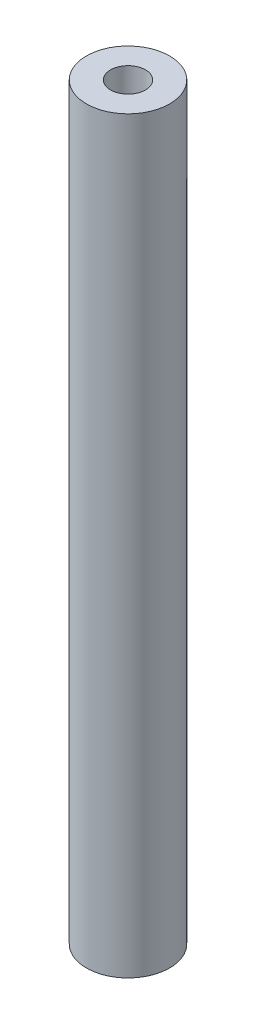
ISO-10303-21;
HEADER;
FILE_DESCRIPTION(('STEP AP214'),'2;1');
FILE_NAME('part.step','',(''),(''),'','','');
FILE_SCHEMA(('AUTOMOTIVE_DESIGN { 1 0 10303 214 1 1 1 1 }'));
ENDSEC;
DATA;
#1=APPLICATION_CONTEXT('core data for automotive mechanical design processes');
#2=APPLICATION_PROTOCOL_DEFINITION('international standard','automotive_design',2000,#1);
#3=PRODUCT_CONTEXT('',#1,'mechanical');
#4=PRODUCT('Part','Part','',(#3));
#5=PRODUCT_RELATED_PRODUCT_CATEGORY('part','',(#4));
#6=PRODUCT_DEFINITION_FORMATION('','',#4);
#7=PRODUCT_DEFINITION_CONTEXT('part definition',#1,'design');
#8=PRODUCT_DEFINITION('design','',#6,#7);
#9=PRODUCT_DEFINITION_SHAPE('','',#8);
#10=(LENGTH_UNIT() NAMED_UNIT(*) SI_UNIT(.MILLI.,.METRE.));
#11=(NAMED_UNIT(*) PLANE_ANGLE_UNIT() SI_UNIT($,.RADIAN.));
#12=(NAMED_UNIT(*) SI_UNIT($,.STERADIAN.) SOLID_ANGLE_UNIT());
#13=UNCERTAINTY_MEASURE_WITH_UNIT(LENGTH_MEASURE(1.E-05),#10,'distance_accuracy_value','');
#14=(GEOMETRIC_REPRESENTATION_CONTEXT(3) GLOBAL_UNCERTAINTY_ASSIGNED_CONTEXT((#13)) GLOBAL_UNIT_ASSIGNED_CONTEXT((#10,
#11,#12)) REPRESENTATION_CONTEXT('',''));
#15=CARTESIAN_POINT('',(0.,0.,0.));
#16=DIRECTION('',(0.,0.,1.));
#17=DIRECTION('',(1.,0.,0.));
#18=AXIS2_PLACEMENT_3D('',#15,#16,#17);
#19=CARTESIAN_POINT('',(0.,90.,0.));
#20=DIRECTION('',(0.,-1.,0.));
#21=DIRECTION('',(0.,0.,-1.));
#22=AXIS2_PLACEMENT_3D('',#19,#20,#21);
#23=CYLINDRICAL_SURFACE('',#22,5.);
#24=CARTESIAN_POINT('',(0.,90.,0.));
#25=DIRECTION('',(0.,1.,0.));
#26=DIRECTION('',(0.,0.,1.));
#27=AXIS2_PLACEMENT_3D('',#24,#25,#26);
#28=CIRCLE('',#27,5.);
#29=CARTESIAN_POINT('',(0.,90.,-5.));
#30=VERTEX_POINT('',#29);
#31=EDGE_CURVE('E10',#30,#30,#28,.T.);
#32=CARTESIAN_POINT('',(0.,0.,0.));
#33=DIRECTION('',(0.,1.,0.));
#34=DIRECTION('',(0.,0.,1.));
#35=AXIS2_PLACEMENT_3D('',#32,#33,#34);
#36=CIRCLE('',#35,5.);
#37=CARTESIAN_POINT('',(0.,0.,-5.));
#38=VERTEX_POINT('',#37);
#39=EDGE_CURVE('E37',#38,#38,#36,.T.);
#40=CARTESIAN_POINT('',(0.,90.,-5.));
#41=CARTESIAN_POINT('',(0.,89.0625,-5.));
#42=CARTESIAN_POINT('',(0.,88.125,-5.));
#43=CARTESIAN_POINT('',(0.,86.25,-5.));
#44=CARTESIAN_POINT('',(0.,85.3125,-5.));
#45=CARTESIAN_POINT('',(0.,83.4375,-5.));
#46=CARTESIAN_POINT('',(0.,82.5,-5.));
#47=CARTESIAN_POINT('',(0.,80.625,-5.));
#48=CARTESIAN_POINT('',(0.,79.6875,-5.));
#49=CARTESIAN_POINT('',(0.,77.8125,-5.));
#50=CARTESIAN_POINT('',(0.,76.875,-5.));
#51=CARTESIAN_POINT('',(0.,75.,-5.));
#52=CARTESIAN_POINT('',(0.,74.0625,-5.));
#53=CARTESIAN_POINT('',(0.,72.1875,-5.));
#54=CARTESIAN_POINT('',(0.,71.25,-5.));
#55=CARTESIAN_POINT('',(0.,69.375,-5.));
#56=CARTESIAN_POINT('',(0.,68.4375,-5.));
#57=CARTESIAN_POINT('',(0.,66.5625,-5.));
#58=CARTESIAN_POINT('',(0.,65.625,-5.));
#59=CARTESIAN_POINT('',(0.,63.75,-5.));
#60=CARTESIAN_POINT('',(0.,62.8125,-5.));
#61=CARTESIAN_POINT('',(0.,60.9375,-5.));
#62=CARTESIAN_POINT('',(0.,60.,-5.));
#63=CARTESIAN_POINT('',(0.,58.125,-5.));
#64=CARTESIAN_POINT('',(0.,57.1875,-5.));
#65=CARTESIAN_POINT('',(0.,55.3125,-5.));
#66=CARTESIAN_POINT('',(0.,54.375,-5.));
#67=CARTESIAN_POINT('',(0.,52.5,-5.));
#68=CARTESIAN_POINT('',(0.,51.5625,-5.));
#69=CARTESIAN_POINT('',(0.,49.6875,-5.));
#70=CARTESIAN_POINT('',(0.,48.75,-5.));
#71=CARTESIAN_POINT('',(0.,46.875,-5.));
#72=CARTESIAN_POINT('',(0.,45.9375,-5.));
#73=CARTESIAN_POINT('',(0.,44.0625,-5.));
#74=CARTESIAN_POINT('',(0.,43.125,-5.));
#75=CARTESIAN_POINT('',(0.,41.25,-5.));
#76=CARTESIAN_POINT('',(0.,40.3125,-5.));
#77=CARTESIAN_POINT('',(0.,38.4375,-5.));
#78=CARTESIAN_POINT('',(0.,37.5,-5.));
#79=CARTESIAN_POINT('',(0.,35.625,-5.));
#80=CARTESIAN_POINT('',(0.,34.6875,-5.));
#81=CARTESIAN_POINT('',(0.,32.8125,-5.));
#82=CARTESIAN_POINT('',(0.,31.875,-5.));
#83=CARTESIAN_POINT('',(0.,30.,-5.));
#84=CARTESIAN_POINT('',(0.,29.0625,-5.));
#85=CARTESIAN_POINT('',(0.,27.1875,-5.));
#86=CARTESIAN_POINT('',(0.,26.25,-5.));
#87=CARTESIAN_POINT('',(0.,24.375,-5.));
#88=CARTESIAN_POINT('',(0.,23.4375,-5.));
#89=CARTESIAN_POINT('',(0.,21.5625,-5.));
#90=CARTESIAN_POINT('',(0.,20.625,-5.));
#91=CARTESIAN_POINT('',(0.,18.75,-5.));
#92=CARTESIAN_POINT('',(0.,17.8125,-5.));
#93=CARTESIAN_POINT('',(0.,15.9375,-5.));
#94=CARTESIAN_POINT('',(0.,15.,-5.));
#95=CARTESIAN_POINT('',(0.,13.125,-5.));
#96=CARTESIAN_POINT('',(0.,12.1875,-5.));
#97=CARTESIAN_POINT('',(0.,10.3125,-5.));
#98=CARTESIAN_POINT('',(0.,9.37499999999999,-5.));
#99=CARTESIAN_POINT('',(0.,7.49999999999999,-5.));
#100=CARTESIAN_POINT('',(0.,6.56249999999999,-5.));
#101=CARTESIAN_POINT('',(0.,4.68749999999999,-5.));
#102=CARTESIAN_POINT('',(0.,3.74999999999998,-5.));
#103=CARTESIAN_POINT('',(0.,1.87499999999998,-5.));
#104=CARTESIAN_POINT('',(0.,0.937499999999986,-5.));
#105=CARTESIAN_POINT('',(0.,0.,-5.));
#106=B_SPLINE_CURVE_WITH_KNOTS('',3,(#40,#41,#42,#43,#44,#45,#46,#47,#48,#49,#50,#51,#52,#53,
#54,#55,#56,#57,#58,#59,#60,#61,#62,#63,#64,#65,#66,#67,#68,#69,#70,#71,#72,#73,#74,#75,#76,#77,
#78,#79,#80,#81,#82,#83,#84,#85,#86,#87,#88,#89,#90,#91,#92,#93,#94,#95,#96,#97,#98,#99,#100,
#101,#102,#103,#104,#105),.UNSPECIFIED.,.F.,.F.,(4,2,2,2,2,2,2,2,2,2,2,2,2,2,2,2,2,2,2,2,2,2,2,
2,2,2,2,2,2,2,2,2,4),(0.,2.8125,5.62499999999999,8.43749999999999,11.25,14.0625,16.875,19.6875,
22.5,25.3125,28.125,30.9375,33.75,36.5625,39.375,42.1875,45.,47.8125,50.625,53.4375,56.25,
59.0625,61.875,64.6875,67.5,70.3125,73.125,75.9375,78.75,81.5625,84.375,87.1875,90.),.UNSPECIFIED.);
#107=EDGE_CURVE('BSEAM40',#30,#38,#106,.T.);
#108=ORIENTED_EDGE('',*,*,#31,.F.);
#109=ORIENTED_EDGE('',*,*,#39,.T.);
#110=ORIENTED_EDGE('',*,*,#107,.T.);
#111=ORIENTED_EDGE('',*,*,#107,.F.);
#112=EDGE_LOOP('',(#108,#110,#109,#111));
#113=FACE_BOUND('',#112,.T.);
#114=ADVANCED_FACE('F40',(#113),#23,.T.);
#115=CARTESIAN_POINT('',(0.,90.,0.));
#116=DIRECTION('',(0.,1.,0.));
#117=DIRECTION('',(0.,0.,1.));
#118=AXIS2_PLACEMENT_3D('',#115,#116,#117);
#119=PLANE('',#118);
#120=CARTESIAN_POINT('',(0.,90.,0.));
#121=DIRECTION('',(0.,1.,0.));
#122=DIRECTION('',(0.,0.,1.));
#123=AXIS2_PLACEMENT_3D('',#120,#121,#122);
#124=CIRCLE('',#123,2.1);
#125=CARTESIAN_POINT('',(0.,90.,2.1));
#126=VERTEX_POINT('',#125);
#127=EDGE_CURVE('E47',#126,#126,#124,.T.);
#128=ORIENTED_EDGE('',*,*,#127,.F.);
#129=EDGE_LOOP('',(#128));
#130=FACE_BOUND('',#129,.T.);
#131=ORIENTED_EDGE('',*,*,#31,.T.);
#132=EDGE_LOOP('',(#131));
#133=FACE_BOUND('',#132,.T.);
#134=ADVANCED_FACE('F62',(#130,#133),#119,.T.);
#135=CARTESIAN_POINT('',(0.,0.,0.));
#136=DIRECTION('',(0.,1.,0.));
#137=DIRECTION('',(0.,0.,1.));
#138=AXIS2_PLACEMENT_3D('',#135,#136,#137);
#139=PLANE('',#138);
#140=CARTESIAN_POINT('',(0.,0.,0.));
#141=DIRECTION('',(0.,1.,0.));
#142=DIRECTION('',(0.,0.,1.));
#143=AXIS2_PLACEMENT_3D('',#140,#141,#142);
#144=CIRCLE('',#143,2.1);
#145=CARTESIAN_POINT('',(0.,0.,2.1));
#146=VERTEX_POINT('',#145);
#147=EDGE_CURVE('E50',#146,#146,#144,.T.);
#148=ORIENTED_EDGE('',*,*,#147,.T.);
#149=EDGE_LOOP('',(#148));
#150=FACE_BOUND('',#149,.T.);
#151=ORIENTED_EDGE('',*,*,#39,.F.);
#152=EDGE_LOOP('',(#151));
#153=FACE_BOUND('',#152,.T.);
#154=ADVANCED_FACE('F54',(#150,#153),#139,.F.);
#155=CARTESIAN_POINT('',(0.,0.,0.));
#156=DIRECTION('',(0.,1.,0.));
#157=DIRECTION('',(0.,0.,1.));
#158=AXIS2_PLACEMENT_3D('',#155,#156,#157);
#159=CYLINDRICAL_SURFACE('',#158,2.1);
#160=CARTESIAN_POINT('',(0.,0.,2.1));
#161=CARTESIAN_POINT('',(0.,0.937499999999998,2.1));
#162=CARTESIAN_POINT('',(0.,1.875,2.1));
#163=CARTESIAN_POINT('',(0.,3.75,2.1));
#164=CARTESIAN_POINT('',(0.,4.6875,2.1));
#165=CARTESIAN_POINT('',(0.,6.5625,2.1));
#166=CARTESIAN_POINT('',(0.,7.5,2.1));
#167=CARTESIAN_POINT('',(0.,9.375,2.1));
#168=CARTESIAN_POINT('',(0.,10.3125,2.1));
#169=CARTESIAN_POINT('',(0.,12.1875,2.1));
#170=CARTESIAN_POINT('',(0.,13.125,2.1));
#171=CARTESIAN_POINT('',(0.,15.,2.1));
#172=CARTESIAN_POINT('',(0.,15.9375,2.1));
#173=CARTESIAN_POINT('',(0.,17.8125,2.1));
#174=CARTESIAN_POINT('',(0.,18.75,2.1));
#175=CARTESIAN_POINT('',(0.,20.625,2.1));
#176=CARTESIAN_POINT('',(0.,21.5625,2.1));
#177=CARTESIAN_POINT('',(0.,23.4375,2.1));
#178=CARTESIAN_POINT('',(0.,24.375,2.1));
#179=CARTESIAN_POINT('',(0.,26.25,2.1));
#180=CARTESIAN_POINT('',(0.,27.1875,2.1));
#181=CARTESIAN_POINT('',(0.,29.0625,2.1));
#182=CARTESIAN_POINT('',(0.,30.,2.1));
#183=CARTESIAN_POINT('',(0.,31.875,2.1));
#184=CARTESIAN_POINT('',(0.,32.8125,2.1));
#185=CARTESIAN_POINT('',(0.,34.6875,2.1));
#186=CARTESIAN_POINT('',(0.,35.625,2.1));
#187=CARTESIAN_POINT('',(0.,37.5,2.1));
#188=CARTESIAN_POINT('',(0.,38.4375,2.1));
#189=CARTESIAN_POINT('',(0.,40.3125,2.1));
#190=CARTESIAN_POINT('',(0.,41.25,2.1));
#191=CARTESIAN_POINT('',(0.,43.125,2.1));
#192=CARTESIAN_POINT('',(0.,44.0625,2.1));
#193=CARTESIAN_POINT('',(0.,45.9375,2.1));
#194=CARTESIAN_POINT('',(0.,46.875,2.1));
#195=CARTESIAN_POINT('',(0.,48.75,2.1));
#196=CARTESIAN_POINT('',(0.,49.6875,2.1));
#197=CARTESIAN_POINT('',(0.,51.5625,2.1));
#198=CARTESIAN_POINT('',(0.,52.5,2.1));
#199=CARTESIAN_POINT('',(0.,54.375,2.1));
#200=CARTESIAN_POINT('',(0.,55.3125,2.1));
#201=CARTESIAN_POINT('',(0.,57.1875,2.1));
#202=CARTESIAN_POINT('',(0.,58.125,2.1));
#203=CARTESIAN_POINT('',(0.,60.,2.1));
#204=CARTESIAN_POINT('',(0.,60.9375,2.1));
#205=CARTESIAN_POINT('',(0.,62.8125,2.1));
#206=CARTESIAN_POINT('',(0.,63.75,2.1));
#207=CARTESIAN_POINT('',(0.,65.625,2.1));
#208=CARTESIAN_POINT('',(0.,66.5625,2.1));
#209=CARTESIAN_POINT('',(0.,68.4375,2.1));
#210=CARTESIAN_POINT('',(0.,69.375,2.1));
#211=CARTESIAN_POINT('',(0.,71.25,2.1));
#212=CARTESIAN_POINT('',(0.,72.1875,2.1));
#213=CARTESIAN_POINT('',(0.,74.0625,2.1));
#214=CARTESIAN_POINT('',(0.,75.,2.1));
#215=CARTESIAN_POINT('',(0.,76.875,2.1));
#216=CARTESIAN_POINT('',(0.,77.8125,2.1));
#217=CARTESIAN_POINT('',(0.,79.6875,2.1));
#218=CARTESIAN_POINT('',(0.,80.625,2.1));
#219=CARTESIAN_POINT('',(0.,82.5,2.1));
#220=CARTESIAN_POINT('',(0.,83.4375,2.1));
#221=CARTESIAN_POINT('',(0.,85.3125,2.1));
#222=CARTESIAN_POINT('',(0.,86.25,2.1));
#223=CARTESIAN_POINT('',(0.,88.125,2.1));
#224=CARTESIAN_POINT('',(0.,89.0625,2.1));
#225=CARTESIAN_POINT('',(0.,90.,2.1));
#226=B_SPLINE_CURVE_WITH_KNOTS('',3,(#160,#161,#162,#163,#164,#165,#166,#167,#168,#169,#170,
#171,#172,#173,#174,#175,#176,#177,#178,#179,#180,#181,#182,#183,#184,#185,#186,#187,#188,#189,
#190,#191,#192,#193,#194,#195,#196,#197,#198,#199,#200,#201,#202,#203,#204,#205,#206,#207,#208,
#209,#210,#211,#212,#213,#214,#215,#216,#217,#218,#219,#220,#221,#222,#223,#224,#225),
.UNSPECIFIED.,.F.,.F.,(4,2,2,2,2,2,2,2,2,2,2,2,2,2,2,2,2,2,2,2,2,2,2,2,2,2,2,2,2,2,2,2,4),(0.,
2.8125,5.625,8.4375,11.25,14.0625,16.875,19.6875,22.5,25.3125,28.125,30.9375,33.75,36.5625,
39.375,42.1875,45.,47.8125,50.625,53.4375,56.25,59.0625,61.875,64.6875,67.5,70.3125,73.125,
75.9375,78.75,81.5625,84.375,87.1875,90.),.UNSPECIFIED.);
#227=EDGE_CURVE('BSEAM59',#146,#126,#226,.T.);
#228=ORIENTED_EDGE('',*,*,#147,.F.);
#229=ORIENTED_EDGE('',*,*,#127,.T.);
#230=ORIENTED_EDGE('',*,*,#227,.T.);
#231=ORIENTED_EDGE('',*,*,#227,.F.);
#232=EDGE_LOOP('',(#228,#230,#229,#231));
#233=FACE_BOUND('',#232,.T.);
#234=ADVANCED_FACE('F59',(#233),#159,.F.);
#235=CLOSED_SHELL('',(#114,#134,#154,#234));
#236=MANIFOLD_SOLID_BREP('B2',#235);
#237=ADVANCED_BREP_SHAPE_REPRESENTATION('',(#18,#236),#14);
#238=SHAPE_DEFINITION_REPRESENTATION(#9,#237);
ENDSEC;
END-ISO-10303-21;
